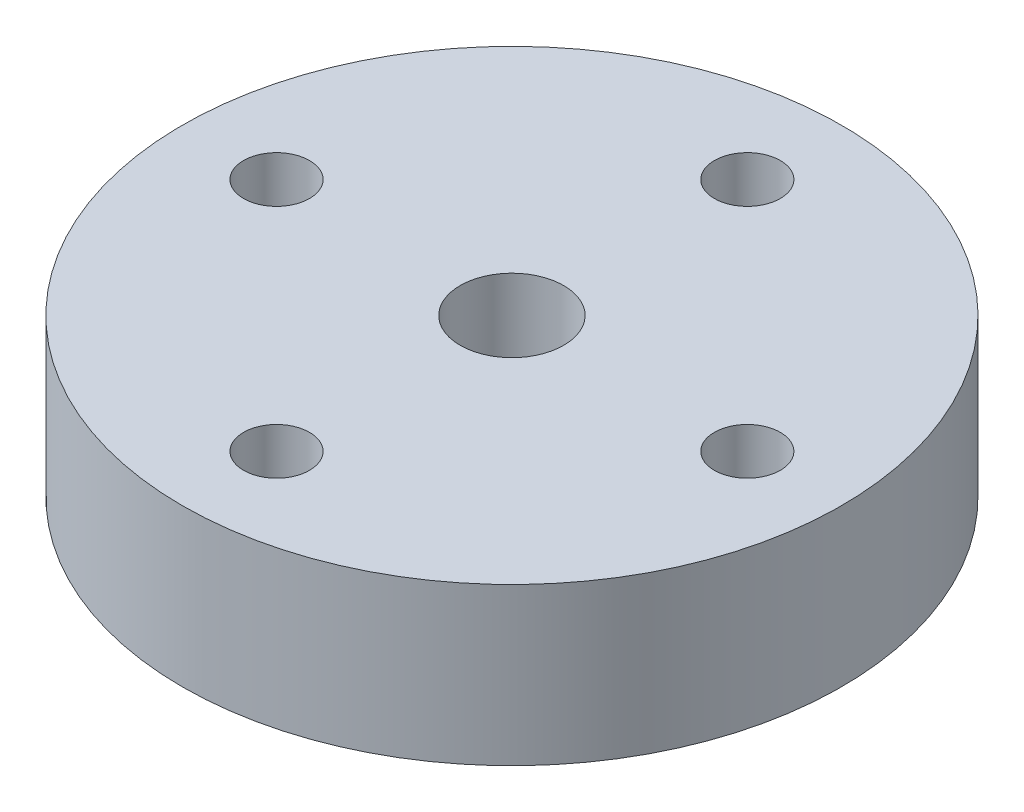
ISO-10303-21;
HEADER;
FILE_DESCRIPTION(('STEP AP214'),'2;1');
FILE_NAME('part.step','',(''),(''),'','','');
FILE_SCHEMA(('AUTOMOTIVE_DESIGN { 1 0 10303 214 1 1 1 1 }'));
ENDSEC;
DATA;
#1=APPLICATION_CONTEXT('core data for automotive mechanical design processes');
#2=APPLICATION_PROTOCOL_DEFINITION('international standard','automotive_design',2000,#1);
#3=PRODUCT_CONTEXT('',#1,'mechanical');
#4=PRODUCT('Part','Part','',(#3));
#5=PRODUCT_RELATED_PRODUCT_CATEGORY('part','',(#4));
#6=PRODUCT_DEFINITION_FORMATION('','',#4);
#7=PRODUCT_DEFINITION_CONTEXT('part definition',#1,'design');
#8=PRODUCT_DEFINITION('design','',#6,#7);
#9=PRODUCT_DEFINITION_SHAPE('','',#8);
#10=(LENGTH_UNIT() NAMED_UNIT(*) SI_UNIT(.MILLI.,.METRE.));
#11=(NAMED_UNIT(*) PLANE_ANGLE_UNIT() SI_UNIT($,.RADIAN.));
#12=(NAMED_UNIT(*) SI_UNIT($,.STERADIAN.) SOLID_ANGLE_UNIT());
#13=UNCERTAINTY_MEASURE_WITH_UNIT(LENGTH_MEASURE(1.E-05),#10,'distance_accuracy_value','');
#14=(GEOMETRIC_REPRESENTATION_CONTEXT(3) GLOBAL_UNCERTAINTY_ASSIGNED_CONTEXT((#13)) GLOBAL_UNIT_ASSIGNED_CONTEXT((#10,
#11,#12)) REPRESENTATION_CONTEXT('',''));
#15=CARTESIAN_POINT('',(0.,0.,0.));
#16=DIRECTION('',(0.,0.,1.));
#17=DIRECTION('',(1.,0.,0.));
#18=AXIS2_PLACEMENT_3D('',#15,#16,#17);
#19=CARTESIAN_POINT('',(0.,5.,0.));
#20=DIRECTION('',(0.,1.,0.));
#21=DIRECTION('',(0.,0.,1.));
#22=AXIS2_PLACEMENT_3D('',#19,#20,#21);
#23=PLANE('',#22);
#24=CARTESIAN_POINT('',(7.5,5.,0.));
#25=DIRECTION('',(0.,1.,0.));
#26=DIRECTION('',(0.,0.,1.));
#27=AXIS2_PLACEMENT_3D('',#24,#25,#26);
#28=CIRCLE('',#27,1.05);
#29=CARTESIAN_POINT('',(7.5,5.,1.05));
#30=VERTEX_POINT('',#29);
#31=EDGE_CURVE('E65',#30,#30,#28,.T.);
#32=ORIENTED_EDGE('',*,*,#31,.F.);
#33=EDGE_LOOP('',(#32));
#34=FACE_BOUND('',#33,.T.);
#35=CARTESIAN_POINT('',(-7.5,5.,0.));
#36=DIRECTION('',(0.,1.,0.));
#37=DIRECTION('',(0.,0.,1.));
#38=AXIS2_PLACEMENT_3D('',#35,#36,#37);
#39=CIRCLE('',#38,1.05);
#40=CARTESIAN_POINT('',(-7.5,5.,1.05));
#41=VERTEX_POINT('',#40);
#42=EDGE_CURVE('E53',#41,#41,#39,.T.);
#43=ORIENTED_EDGE('',*,*,#42,.F.);
#44=EDGE_LOOP('',(#43));
#45=FACE_BOUND('',#44,.T.);
#46=CARTESIAN_POINT('',(0.,5.,0.));
#47=DIRECTION('',(0.,1.,0.));
#48=DIRECTION('',(0.,0.,1.));
#49=AXIS2_PLACEMENT_3D('',#46,#47,#48);
#50=CIRCLE('',#49,10.5);
#51=CARTESIAN_POINT('',(0.,5.,10.5));
#52=VERTEX_POINT('',#51);
#53=EDGE_CURVE('E10',#52,#52,#50,.T.);
#54=ORIENTED_EDGE('',*,*,#53,.T.);
#55=EDGE_LOOP('',(#54));
#56=FACE_BOUND('',#55,.T.);
#57=CARTESIAN_POINT('',(0.,5.,0.));
#58=DIRECTION('',(0.,1.,0.));
#59=DIRECTION('',(0.,0.,1.));
#60=AXIS2_PLACEMENT_3D('',#57,#58,#59);
#61=CIRCLE('',#60,1.65);
#62=CARTESIAN_POINT('',(0.,5.,1.65));
#63=VERTEX_POINT('',#62);
#64=EDGE_CURVE('E48',#63,#63,#61,.T.);
#65=ORIENTED_EDGE('',*,*,#64,.F.);
#66=EDGE_LOOP('',(#65));
#67=FACE_BOUND('',#66,.T.);
#68=CARTESIAN_POINT('',(0.,5.,-7.5));
#69=DIRECTION('',(0.,1.,0.));
#70=DIRECTION('',(0.,0.,1.));
#71=AXIS2_PLACEMENT_3D('',#68,#69,#70);
#72=CIRCLE('',#71,1.05);
#73=CARTESIAN_POINT('',(0.,5.,-6.45));
#74=VERTEX_POINT('',#73);
#75=EDGE_CURVE('E59',#74,#74,#72,.T.);
#76=ORIENTED_EDGE('',*,*,#75,.F.);
#77=EDGE_LOOP('',(#76));
#78=FACE_BOUND('',#77,.T.);
#79=CARTESIAN_POINT('',(0.,5.,7.5));
#80=DIRECTION('',(0.,1.,0.));
#81=DIRECTION('',(0.,0.,1.));
#82=AXIS2_PLACEMENT_3D('',#79,#80,#81);
#83=CIRCLE('',#82,1.05);
#84=CARTESIAN_POINT('',(0.,5.,8.55));
#85=VERTEX_POINT('',#84);
#86=EDGE_CURVE('E71',#85,#85,#83,.T.);
#87=ORIENTED_EDGE('',*,*,#86,.F.);
#88=EDGE_LOOP('',(#87));
#89=FACE_BOUND('',#88,.T.);
#90=ADVANCED_FACE('F37',(#34,#45,#56,#67,#78,#89),#23,.T.);
#91=CARTESIAN_POINT('',(0.,0.,0.));
#92=DIRECTION('',(0.,1.,0.));
#93=DIRECTION('',(0.,0.,1.));
#94=AXIS2_PLACEMENT_3D('',#91,#92,#93);
#95=PLANE('',#94);
#96=CARTESIAN_POINT('',(0.,0.,0.));
#97=DIRECTION('',(0.,1.,0.));
#98=DIRECTION('',(0.,0.,1.));
#99=AXIS2_PLACEMENT_3D('',#96,#97,#98);
#100=CIRCLE('',#99,10.5);
#101=CARTESIAN_POINT('',(0.,0.,10.5));
#102=VERTEX_POINT('',#101);
#103=EDGE_CURVE('E41',#102,#102,#100,.T.);
#104=ORIENTED_EDGE('',*,*,#103,.F.);
#105=EDGE_LOOP('',(#104));
#106=FACE_BOUND('',#105,.T.);
#107=CARTESIAN_POINT('',(0.,0.,0.));
#108=DIRECTION('',(0.,1.,0.));
#109=DIRECTION('',(0.,0.,1.));
#110=AXIS2_PLACEMENT_3D('',#107,#108,#109);
#111=CIRCLE('',#110,1.65);
#112=CARTESIAN_POINT('',(0.,0.,1.65));
#113=VERTEX_POINT('',#112);
#114=EDGE_CURVE('E50',#113,#113,#111,.T.);
#115=ORIENTED_EDGE('',*,*,#114,.T.);
#116=EDGE_LOOP('',(#115));
#117=FACE_BOUND('',#116,.T.);
#118=CARTESIAN_POINT('',(-7.5,0.,0.));
#119=DIRECTION('',(0.,1.,0.));
#120=DIRECTION('',(0.,0.,1.));
#121=AXIS2_PLACEMENT_3D('',#118,#119,#120);
#122=CIRCLE('',#121,1.05);
#123=CARTESIAN_POINT('',(-7.5,0.,1.05));
#124=VERTEX_POINT('',#123);
#125=EDGE_CURVE('E56',#124,#124,#122,.T.);
#126=ORIENTED_EDGE('',*,*,#125,.T.);
#127=EDGE_LOOP('',(#126));
#128=FACE_BOUND('',#127,.T.);
#129=CARTESIAN_POINT('',(0.,0.,-7.5));
#130=DIRECTION('',(0.,1.,0.));
#131=DIRECTION('',(0.,0.,1.));
#132=AXIS2_PLACEMENT_3D('',#129,#130,#131);
#133=CIRCLE('',#132,1.05);
#134=CARTESIAN_POINT('',(0.,0.,-6.45));
#135=VERTEX_POINT('',#134);
#136=EDGE_CURVE('E62',#135,#135,#133,.T.);
#137=ORIENTED_EDGE('',*,*,#136,.T.);
#138=EDGE_LOOP('',(#137));
#139=FACE_BOUND('',#138,.T.);
#140=CARTESIAN_POINT('',(7.5,0.,0.));
#141=DIRECTION('',(0.,1.,0.));
#142=DIRECTION('',(0.,0.,1.));
#143=AXIS2_PLACEMENT_3D('',#140,#141,#142);
#144=CIRCLE('',#143,1.05);
#145=CARTESIAN_POINT('',(7.5,0.,1.05));
#146=VERTEX_POINT('',#145);
#147=EDGE_CURVE('E68',#146,#146,#144,.T.);
#148=ORIENTED_EDGE('',*,*,#147,.T.);
#149=EDGE_LOOP('',(#148));
#150=FACE_BOUND('',#149,.T.);
#151=CARTESIAN_POINT('',(0.,0.,7.5));
#152=DIRECTION('',(0.,1.,0.));
#153=DIRECTION('',(0.,0.,1.));
#154=AXIS2_PLACEMENT_3D('',#151,#152,#153);
#155=CIRCLE('',#154,1.05);
#156=CARTESIAN_POINT('',(0.,0.,8.55));
#157=VERTEX_POINT('',#156);
#158=EDGE_CURVE('E74',#157,#157,#155,.T.);
#159=ORIENTED_EDGE('',*,*,#158,.T.);
#160=EDGE_LOOP('',(#159));
#161=FACE_BOUND('',#160,.T.);
#162=ADVANCED_FACE('F84',(#106,#117,#128,#139,#150,#161),#95,.F.);
#163=CARTESIAN_POINT('',(0.,5.,0.));
#164=DIRECTION('',(0.,-1.,0.));
#165=DIRECTION('',(0.,0.,-1.));
#166=AXIS2_PLACEMENT_3D('',#163,#164,#165);
#167=CYLINDRICAL_SURFACE('',#166,10.5);
#168=ORIENTED_EDGE('',*,*,#53,.F.);
#169=EDGE_LOOP('',(#168));
#170=FACE_BOUND('',#169,.T.);
#171=ORIENTED_EDGE('',*,*,#103,.T.);
#172=EDGE_LOOP('',(#171));
#173=FACE_BOUND('',#172,.T.);
#174=ADVANCED_FACE('F39',(#170,#173),#167,.T.);
#175=CARTESIAN_POINT('',(0.,5.,0.));
#176=DIRECTION('',(0.,-1.,0.));
#177=DIRECTION('',(0.,0.,-1.));
#178=AXIS2_PLACEMENT_3D('',#175,#176,#177);
#179=CYLINDRICAL_SURFACE('',#178,1.65);
#180=ORIENTED_EDGE('',*,*,#64,.T.);
#181=EDGE_LOOP('',(#180));
#182=FACE_BOUND('',#181,.T.);
#183=ORIENTED_EDGE('',*,*,#114,.F.);
#184=EDGE_LOOP('',(#183));
#185=FACE_BOUND('',#184,.T.);
#186=ADVANCED_FACE('F94',(#182,#185),#179,.F.);
#187=CARTESIAN_POINT('',(-7.5,5.,0.));
#188=DIRECTION('',(0.,-1.,0.));
#189=DIRECTION('',(0.,0.,-1.));
#190=AXIS2_PLACEMENT_3D('',#187,#188,#189);
#191=CYLINDRICAL_SURFACE('',#190,1.05);
#192=ORIENTED_EDGE('',*,*,#42,.T.);
#193=EDGE_LOOP('',(#192));
#194=FACE_BOUND('',#193,.T.);
#195=ORIENTED_EDGE('',*,*,#125,.F.);
#196=EDGE_LOOP('',(#195));
#197=FACE_BOUND('',#196,.T.);
#198=ADVANCED_FACE('F97',(#194,#197),#191,.F.);
#199=CARTESIAN_POINT('',(0.,5.,-7.5));
#200=DIRECTION('',(0.,-1.,0.));
#201=DIRECTION('',(0.,0.,-1.));
#202=AXIS2_PLACEMENT_3D('',#199,#200,#201);
#203=CYLINDRICAL_SURFACE('',#202,1.05);
#204=ORIENTED_EDGE('',*,*,#75,.T.);
#205=EDGE_LOOP('',(#204));
#206=FACE_BOUND('',#205,.T.);
#207=ORIENTED_EDGE('',*,*,#136,.F.);
#208=EDGE_LOOP('',(#207));
#209=FACE_BOUND('',#208,.T.);
#210=ADVANCED_FACE('F101',(#206,#209),#203,.F.);
#211=CARTESIAN_POINT('',(7.5,5.,0.));
#212=DIRECTION('',(0.,-1.,0.));
#213=DIRECTION('',(0.,0.,-1.));
#214=AXIS2_PLACEMENT_3D('',#211,#212,#213);
#215=CYLINDRICAL_SURFACE('',#214,1.05);
#216=ORIENTED_EDGE('',*,*,#31,.T.);
#217=EDGE_LOOP('',(#216));
#218=FACE_BOUND('',#217,.T.);
#219=ORIENTED_EDGE('',*,*,#147,.F.);
#220=EDGE_LOOP('',(#219));
#221=FACE_BOUND('',#220,.T.);
#222=ADVANCED_FACE('F105',(#218,#221),#215,.F.);
#223=CARTESIAN_POINT('',(0.,5.,7.5));
#224=DIRECTION('',(0.,-1.,0.));
#225=DIRECTION('',(0.,0.,-1.));
#226=AXIS2_PLACEMENT_3D('',#223,#224,#225);
#227=CYLINDRICAL_SURFACE('',#226,1.05);
#228=ORIENTED_EDGE('',*,*,#86,.T.);
#229=EDGE_LOOP('',(#228));
#230=FACE_BOUND('',#229,.T.);
#231=ORIENTED_EDGE('',*,*,#158,.F.);
#232=EDGE_LOOP('',(#231));
#233=FACE_BOUND('',#232,.T.);
#234=ADVANCED_FACE('F80',(#230,#233),#227,.F.);
#235=CLOSED_SHELL('',(#90,#162,#174,#186,#198,#210,#222,#234));
#236=MANIFOLD_SOLID_BREP('B2',#235);
#237=ADVANCED_BREP_SHAPE_REPRESENTATION('',(#18,#236),#14);
#238=SHAPE_DEFINITION_REPRESENTATION(#9,#237);
ENDSEC;
END-ISO-10303-21;
